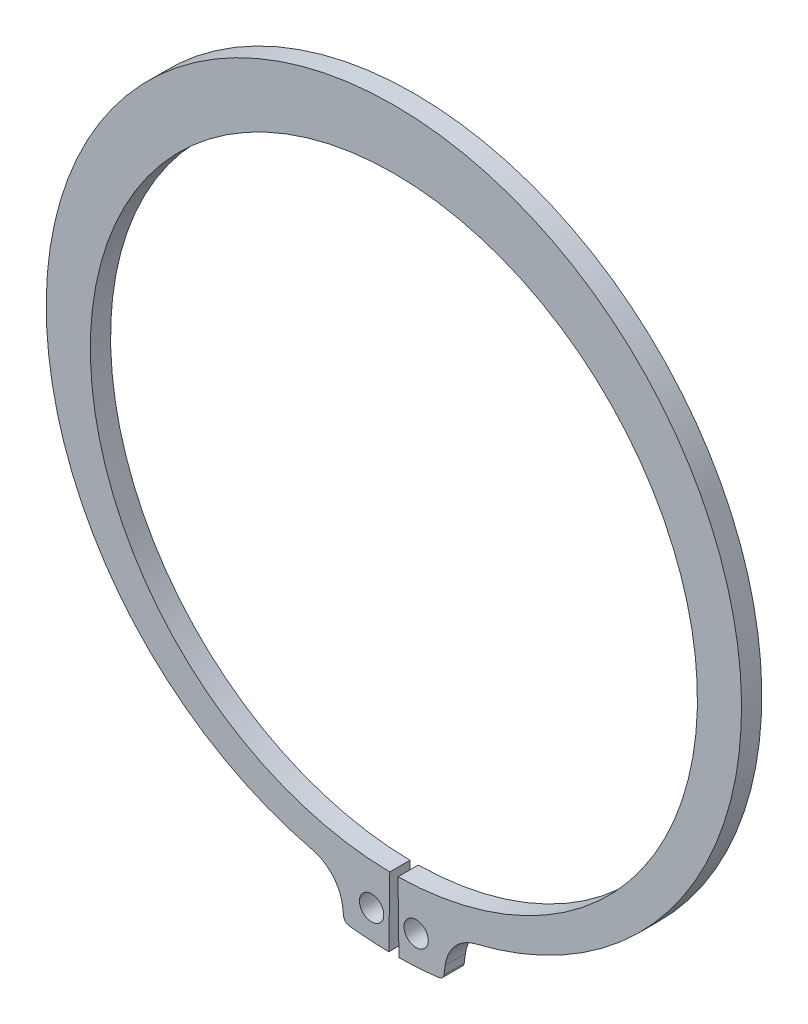
ISO-10303-21;
HEADER;
FILE_DESCRIPTION(('STEP AP214'),'2;1');
FILE_NAME('part.step','',(''),(''),'','','');
FILE_SCHEMA(('AUTOMOTIVE_DESIGN { 1 0 10303 214 1 1 1 1 }'));
ENDSEC;
DATA;
#1=APPLICATION_CONTEXT('core data for automotive mechanical design processes');
#2=APPLICATION_PROTOCOL_DEFINITION('international standard','automotive_design',2000,#1);
#3=PRODUCT_CONTEXT('',#1,'mechanical');
#4=PRODUCT('Part','Part','',(#3));
#5=PRODUCT_RELATED_PRODUCT_CATEGORY('part','',(#4));
#6=PRODUCT_DEFINITION_FORMATION('','',#4);
#7=PRODUCT_DEFINITION_CONTEXT('part definition',#1,'design');
#8=PRODUCT_DEFINITION('design','',#6,#7);
#9=PRODUCT_DEFINITION_SHAPE('','',#8);
#10=(LENGTH_UNIT() NAMED_UNIT(*) SI_UNIT(.MILLI.,.METRE.));
#11=(NAMED_UNIT(*) PLANE_ANGLE_UNIT() SI_UNIT($,.RADIAN.));
#12=(NAMED_UNIT(*) SI_UNIT($,.STERADIAN.) SOLID_ANGLE_UNIT());
#13=UNCERTAINTY_MEASURE_WITH_UNIT(LENGTH_MEASURE(1.E-05),#10,'distance_accuracy_value','');
#14=(GEOMETRIC_REPRESENTATION_CONTEXT(3) GLOBAL_UNCERTAINTY_ASSIGNED_CONTEXT((#13)) GLOBAL_UNIT_ASSIGNED_CONTEXT((#10,
#11,#12)) REPRESENTATION_CONTEXT('',''));
#15=CARTESIAN_POINT('',(0.,0.,0.));
#16=DIRECTION('',(0.,0.,1.));
#17=DIRECTION('',(1.,0.,0.));
#18=AXIS2_PLACEMENT_3D('',#15,#16,#17);
#19=CARTESIAN_POINT('',(0.,0.,-2.5));
#20=DIRECTION('',(0.,0.,1.));
#21=DIRECTION('',(1.,0.,0.));
#22=AXIS2_PLACEMENT_3D('',#19,#20,#21);
#23=CYLINDRICAL_SURFACE('',#22,37.5);
#24=CARTESIAN_POINT('',(0.,0.,0.));
#25=DIRECTION('',(0.,0.,-1.));
#26=DIRECTION('',(1.,0.,0.));
#27=AXIS2_PLACEMENT_3D('',#24,#25,#26);
#28=CIRCLE('',#27,37.5);
#29=CARTESIAN_POINT('',(-0.508405639913232,-37.4965534910251,0.));
#30=VERTEX_POINT('',#29);
#31=CARTESIAN_POINT('',(0.508405639913232,-37.4965534910251,0.));
#32=VERTEX_POINT('',#31);
#33=EDGE_CURVE('E155',#30,#32,#28,.T.);
#34=ORIENTED_EDGE('',*,*,#33,.F.);
#35=DIRECTION('',(0.,0.,1.));
#36=VECTOR('',#35,1.);
#37=CARTESIAN_POINT('',(-0.508405639913232,-37.4965534910251,-2.5));
#38=LINE('',#37,#36);
#39=CARTESIAN_POINT('',(-0.508405639913232,-37.4965534910251,-2.5));
#40=VERTEX_POINT('',#39);
#41=EDGE_CURVE('E11',#40,#30,#38,.T.);
#42=ORIENTED_EDGE('',*,*,#41,.F.);
#43=CARTESIAN_POINT('',(0.,0.,-2.5));
#44=DIRECTION('',(0.,0.,-1.));
#45=DIRECTION('',(1.,0.,0.));
#46=AXIS2_PLACEMENT_3D('',#43,#44,#45);
#47=CIRCLE('',#46,37.5);
#48=CARTESIAN_POINT('',(0.508405639913232,-37.4965534910251,-2.5));
#49=VERTEX_POINT('',#48);
#50=EDGE_CURVE('E188',#40,#49,#47,.T.);
#51=ORIENTED_EDGE('',*,*,#50,.T.);
#52=DIRECTION('',(0.,0.,1.));
#53=VECTOR('',#52,1.);
#54=CARTESIAN_POINT('',(0.508405639913232,-37.4965534910251,-2.5));
#55=LINE('',#54,#53);
#56=EDGE_CURVE('E37',#49,#32,#55,.T.);
#57=ORIENTED_EDGE('',*,*,#56,.T.);
#58=EDGE_LOOP('',(#34,#42,#51,#57));
#59=FACE_BOUND('',#58,.T.);
#60=ADVANCED_FACE('F34',(#59),#23,.F.);
#61=CARTESIAN_POINT('',(-0.508405639913232,-37.4965534910251,-2.5));
#62=DIRECTION('',(0.999908093094002,-0.0135574837310195,0.));
#63=DIRECTION('',(0.0135574837310195,0.999908093094002,0.));
#64=AXIS2_PLACEMENT_3D('',#61,#62,#63);
#65=PLANE('',#64);
#66=DIRECTION('',(0.0135574837310195,0.999908093094002,0.));
#67=VECTOR('',#66,1.);
#68=CARTESIAN_POINT('',(-0.508405639913232,-37.4965534910251,0.));
#69=LINE('',#68,#67);
#70=CARTESIAN_POINT('',(-0.625,-46.0957630916335,0.));
#71=VERTEX_POINT('',#70);
#72=EDGE_CURVE('E186',#71,#30,#69,.T.);
#73=ORIENTED_EDGE('',*,*,#72,.F.);
#74=DIRECTION('',(0.,0.,1.));
#75=VECTOR('',#74,1.);
#76=CARTESIAN_POINT('',(-0.625,-46.0957630916335,-2.5));
#77=LINE('',#76,#75);
#78=CARTESIAN_POINT('',(-0.625,-46.0957630916335,-2.5));
#79=VERTEX_POINT('',#78);
#80=EDGE_CURVE('E43',#79,#71,#77,.T.);
#81=ORIENTED_EDGE('',*,*,#80,.F.);
#82=DIRECTION('',(0.0135574837310195,0.999908093094002,0.));
#83=VECTOR('',#82,1.);
#84=CARTESIAN_POINT('',(-0.508405639913232,-37.4965534910251,-2.5));
#85=LINE('',#84,#83);
#86=EDGE_CURVE('E145',#79,#40,#85,.T.);
#87=ORIENTED_EDGE('',*,*,#86,.T.);
#88=ORIENTED_EDGE('',*,*,#41,.T.);
#89=EDGE_LOOP('',(#73,#81,#87,#88));
#90=FACE_BOUND('',#89,.T.);
#91=ADVANCED_FACE('F208',(#90),#65,.T.);
#92=CARTESIAN_POINT('',(0.,0.,-2.5));
#93=DIRECTION('',(0.,0.,1.));
#94=DIRECTION('',(1.,0.,0.));
#95=AXIS2_PLACEMENT_3D('',#92,#93,#94);
#96=CYLINDRICAL_SURFACE('',#95,46.1);
#97=CARTESIAN_POINT('',(0.,0.,0.));
#98=DIRECTION('',(0.,0.,1.));
#99=DIRECTION('',(1.,0.,0.));
#100=AXIS2_PLACEMENT_3D('',#97,#98,#99);
#101=CIRCLE('',#100,46.1);
#102=CARTESIAN_POINT('',(-5.5462924546099,-45.7651465638201,0.));
#103=VERTEX_POINT('',#102);
#104=EDGE_CURVE('E132',#103,#71,#101,.T.);
#105=ORIENTED_EDGE('',*,*,#104,.F.);
#106=DIRECTION('',(0.,0.,1.));
#107=VECTOR('',#106,1.);
#108=CARTESIAN_POINT('',(-5.5462924546099,-45.7651465638201,-2.5));
#109=LINE('',#108,#107);
#110=CARTESIAN_POINT('',(-5.5462924546099,-45.7651465638201,-2.5));
#111=VERTEX_POINT('',#110);
#112=EDGE_CURVE('E127',#111,#103,#109,.T.);
#113=ORIENTED_EDGE('',*,*,#112,.F.);
#114=CARTESIAN_POINT('',(0.,0.,-2.5));
#115=DIRECTION('',(0.,0.,1.));
#116=DIRECTION('',(1.,0.,0.));
#117=AXIS2_PLACEMENT_3D('',#114,#115,#116);
#118=CIRCLE('',#117,46.1);
#119=EDGE_CURVE('E130',#111,#79,#118,.T.);
#120=ORIENTED_EDGE('',*,*,#119,.T.);
#121=ORIENTED_EDGE('',*,*,#80,.T.);
#122=EDGE_LOOP('',(#105,#113,#120,#121));
#123=FACE_BOUND('',#122,.T.);
#124=ADVANCED_FACE('F129',(#123),#96,.T.);
#125=CARTESIAN_POINT('',(-5.45605993094489,-45.0205942878361,-2.5));
#126=DIRECTION('',(0.,0.,1.));
#127=DIRECTION('',(1.,0.,0.));
#128=AXIS2_PLACEMENT_3D('',#125,#126,#127);
#129=CYLINDRICAL_SURFACE('',#128,0.75);
#130=CARTESIAN_POINT('',(-5.45605993094489,-45.0205942878361,0.));
#131=DIRECTION('',(0.,0.,1.));
#132=DIRECTION('',(1.,0.,0.));
#133=AXIS2_PLACEMENT_3D('',#130,#131,#132);
#134=CIRCLE('',#133,0.75);
#135=CARTESIAN_POINT('',(-6.19964357697525,-45.1184889320011,0.));
#136=VERTEX_POINT('',#135);
#137=EDGE_CURVE('E183',#136,#103,#134,.T.);
#138=ORIENTED_EDGE('',*,*,#137,.F.);
#139=DIRECTION('',(0.,0.,1.));
#140=VECTOR('',#139,1.);
#141=CARTESIAN_POINT('',(-6.19964357697525,-45.1184889320011,-2.5));
#142=LINE('',#141,#140);
#143=CARTESIAN_POINT('',(-6.19964357697525,-45.1184889320011,-2.5));
#144=VERTEX_POINT('',#143);
#145=EDGE_CURVE('E137',#144,#136,#142,.T.);
#146=ORIENTED_EDGE('',*,*,#145,.F.);
#147=CARTESIAN_POINT('',(-5.45605993094489,-45.0205942878361,-2.5));
#148=DIRECTION('',(0.,0.,1.));
#149=DIRECTION('',(1.,0.,0.));
#150=AXIS2_PLACEMENT_3D('',#147,#148,#149);
#151=CIRCLE('',#150,0.75);
#152=EDGE_CURVE('E143',#144,#111,#151,.T.);
#153=ORIENTED_EDGE('',*,*,#152,.T.);
#154=ORIENTED_EDGE('',*,*,#112,.T.);
#155=EDGE_LOOP('',(#138,#146,#153,#154));
#156=FACE_BOUND('',#155,.T.);
#157=ADVANCED_FACE('F147',(#156),#129,.T.);
#158=CARTESIAN_POINT('',(-6.33885093513878,-44.0611040687088,-2.5));
#159=DIRECTION('',(-0.99144486137381,-0.130526192220052,0.));
#160=DIRECTION('',(0.130526192220052,-0.99144486137381,0.));
#161=AXIS2_PLACEMENT_3D('',#158,#159,#160);
#162=PLANE('',#161);
#163=DIRECTION('',(0.130526192220052,-0.99144486137381,0.));
#164=VECTOR('',#163,1.);
#165=CARTESIAN_POINT('',(-6.33885093513878,-44.0611040687088,0.));
#166=LINE('',#165,#164);
#167=CARTESIAN_POINT('',(-6.33885093513878,-44.0611040687088,0.));
#168=VERTEX_POINT('',#167);
#169=EDGE_CURVE('E180',#168,#136,#166,.T.);
#170=ORIENTED_EDGE('',*,*,#169,.F.);
#171=DIRECTION('',(0.,0.,1.));
#172=VECTOR('',#171,1.);
#173=CARTESIAN_POINT('',(-6.33885093513878,-44.0611040687088,-2.5));
#174=LINE('',#173,#172);
#175=CARTESIAN_POINT('',(-6.33885093513878,-44.0611040687088,-2.5));
#176=VERTEX_POINT('',#175);
#177=EDGE_CURVE('E192',#176,#168,#174,.T.);
#178=ORIENTED_EDGE('',*,*,#177,.F.);
#179=DIRECTION('',(0.130526192220052,-0.99144486137381,0.));
#180=VECTOR('',#179,1.);
#181=CARTESIAN_POINT('',(-6.33885093513878,-44.0611040687088,-2.5));
#182=LINE('',#181,#180);
#183=EDGE_CURVE('E148',#176,#144,#182,.T.);
#184=ORIENTED_EDGE('',*,*,#183,.T.);
#185=ORIENTED_EDGE('',*,*,#145,.T.);
#186=EDGE_LOOP('',(#170,#178,#184,#185));
#187=FACE_BOUND('',#186,.T.);
#188=ADVANCED_FACE('F221',(#187),#162,.T.);
#189=CARTESIAN_POINT('',(-11.2462595608808,-44.7071766709697,-2.5));
#190=DIRECTION('',(0.,0.,1.));
#191=DIRECTION('',(1.,0.,0.));
#192=AXIS2_PLACEMENT_3D('',#189,#190,#191);
#193=CYLINDRICAL_SURFACE('',#192,4.94975446132422);
#194=CARTESIAN_POINT('',(-11.2462595608808,-44.7071766709697,0.));
#195=DIRECTION('',(0.,0.,-1.));
#196=DIRECTION('',(1.,0.,0.));
#197=AXIS2_PLACEMENT_3D('',#194,#195,#196);
#198=CIRCLE('',#197,4.94975446132422);
#199=CARTESIAN_POINT('',(-10.084076166299,-39.8957944387253,0.));
#200=VERTEX_POINT('',#199);
#201=EDGE_CURVE('E177',#200,#168,#198,.T.);
#202=ORIENTED_EDGE('',*,*,#201,.F.);
#203=DIRECTION('',(0.,0.,1.));
#204=VECTOR('',#203,1.);
#205=CARTESIAN_POINT('',(-10.084076166299,-39.8957944387253,-2.5));
#206=LINE('',#205,#204);
#207=CARTESIAN_POINT('',(-10.084076166299,-39.8957944387253,-2.5));
#208=VERTEX_POINT('',#207);
#209=EDGE_CURVE('E194',#208,#200,#206,.T.);
#210=ORIENTED_EDGE('',*,*,#209,.F.);
#211=CARTESIAN_POINT('',(-11.2462595608808,-44.7071766709697,-2.5));
#212=DIRECTION('',(0.,0.,-1.));
#213=DIRECTION('',(1.,0.,0.));
#214=AXIS2_PLACEMENT_3D('',#211,#212,#213);
#215=CIRCLE('',#214,4.94975446132422);
#216=EDGE_CURVE('E150',#208,#176,#215,.T.);
#217=ORIENTED_EDGE('',*,*,#216,.T.);
#218=ORIENTED_EDGE('',*,*,#177,.T.);
#219=EDGE_LOOP('',(#202,#210,#217,#218));
#220=FACE_BOUND('',#219,.T.);
#221=ADVANCED_FACE('F224',(#220),#193,.F.);
#222=CARTESIAN_POINT('',(0.,1.85178612500171,-2.5));
#223=DIRECTION('',(0.,0.,1.));
#224=DIRECTION('',(1.,0.,0.));
#225=AXIS2_PLACEMENT_3D('',#222,#223,#224);
#226=CYLINDRICAL_SURFACE('',#225,42.9482138749983);
#227=CARTESIAN_POINT('',(0.,1.85178612500171,0.));
#228=DIRECTION('',(0.,0.,1.));
#229=DIRECTION('',(1.,0.,0.));
#230=AXIS2_PLACEMENT_3D('',#227,#228,#229);
#231=CIRCLE('',#230,42.9482138749983);
#232=CARTESIAN_POINT('',(10.0840761662989,-39.8957944387253,0.));
#233=VERTEX_POINT('',#232);
#234=EDGE_CURVE('E174',#233,#200,#231,.T.);
#235=ORIENTED_EDGE('',*,*,#234,.F.);
#236=DIRECTION('',(0.,0.,1.));
#237=VECTOR('',#236,1.);
#238=CARTESIAN_POINT('',(10.0840761662989,-39.8957944387253,-2.5));
#239=LINE('',#238,#237);
#240=CARTESIAN_POINT('',(10.0840761662989,-39.8957944387253,-2.5));
#241=VERTEX_POINT('',#240);
#242=EDGE_CURVE('E196',#241,#233,#239,.T.);
#243=ORIENTED_EDGE('',*,*,#242,.F.);
#244=CARTESIAN_POINT('',(0.,1.85178612500171,-2.5));
#245=DIRECTION('',(0.,0.,1.));
#246=DIRECTION('',(1.,0.,0.));
#247=AXIS2_PLACEMENT_3D('',#244,#245,#246);
#248=CIRCLE('',#247,42.9482138749983);
#249=EDGE_CURVE('E298',#241,#208,#248,.T.);
#250=ORIENTED_EDGE('',*,*,#249,.T.);
#251=ORIENTED_EDGE('',*,*,#209,.T.);
#252=EDGE_LOOP('',(#235,#243,#250,#251));
#253=FACE_BOUND('',#252,.T.);
#254=ADVANCED_FACE('F228',(#253),#226,.T.);
#255=CARTESIAN_POINT('',(11.2462595608808,-44.7071766709697,-2.5));
#256=DIRECTION('',(0.,0.,1.));
#257=DIRECTION('',(1.,0.,0.));
#258=AXIS2_PLACEMENT_3D('',#255,#256,#257);
#259=CYLINDRICAL_SURFACE('',#258,4.94975446132422);
#260=CARTESIAN_POINT('',(11.2462595608808,-44.7071766709697,0.));
#261=DIRECTION('',(0.,0.,-1.));
#262=DIRECTION('',(1.,0.,0.));
#263=AXIS2_PLACEMENT_3D('',#260,#261,#262);
#264=CIRCLE('',#263,4.94975446132422);
#265=CARTESIAN_POINT('',(6.33885093513878,-44.0611040687089,0.));
#266=VERTEX_POINT('',#265);
#267=EDGE_CURVE('E171',#266,#233,#264,.T.);
#268=ORIENTED_EDGE('',*,*,#267,.F.);
#269=DIRECTION('',(0.,0.,1.));
#270=VECTOR('',#269,1.);
#271=CARTESIAN_POINT('',(6.33885093513878,-44.0611040687089,-2.5));
#272=LINE('',#271,#270);
#273=CARTESIAN_POINT('',(6.33885093513878,-44.0611040687089,-2.5));
#274=VERTEX_POINT('',#273);
#275=EDGE_CURVE('E198',#274,#266,#272,.T.);
#276=ORIENTED_EDGE('',*,*,#275,.F.);
#277=CARTESIAN_POINT('',(11.2462595608808,-44.7071766709697,-2.5));
#278=DIRECTION('',(0.,0.,-1.));
#279=DIRECTION('',(1.,0.,0.));
#280=AXIS2_PLACEMENT_3D('',#277,#278,#279);
#281=CIRCLE('',#280,4.94975446132422);
#282=EDGE_CURVE('E295',#274,#241,#281,.T.);
#283=ORIENTED_EDGE('',*,*,#282,.T.);
#284=ORIENTED_EDGE('',*,*,#242,.T.);
#285=EDGE_LOOP('',(#268,#276,#283,#284));
#286=FACE_BOUND('',#285,.T.);
#287=ADVANCED_FACE('F232',(#286),#259,.F.);
#288=CARTESIAN_POINT('',(6.33885093513879,-44.0611040687089,-2.5));
#289=DIRECTION('',(0.99144486137381,-0.130526192220055,0.));
#290=DIRECTION('',(0.130526192220055,0.99144486137381,0.));
#291=AXIS2_PLACEMENT_3D('',#288,#289,#290);
#292=PLANE('',#291);
#293=DIRECTION('',(0.130526192220055,0.99144486137381,0.));
#294=VECTOR('',#293,1.);
#295=CARTESIAN_POINT('',(6.33885093513879,-44.0611040687089,0.));
#296=LINE('',#295,#294);
#297=CARTESIAN_POINT('',(6.19964357697525,-45.1184889320011,0.));
#298=VERTEX_POINT('',#297);
#299=EDGE_CURVE('E168',#298,#266,#296,.T.);
#300=ORIENTED_EDGE('',*,*,#299,.F.);
#301=DIRECTION('',(0.,0.,1.));
#302=VECTOR('',#301,1.);
#303=CARTESIAN_POINT('',(6.19964357697525,-45.1184889320011,-2.5));
#304=LINE('',#303,#302);
#305=CARTESIAN_POINT('',(6.19964357697525,-45.1184889320011,-2.5));
#306=VERTEX_POINT('',#305);
#307=EDGE_CURVE('E200',#306,#298,#304,.T.);
#308=ORIENTED_EDGE('',*,*,#307,.F.);
#309=DIRECTION('',(0.130526192220055,0.99144486137381,0.));
#310=VECTOR('',#309,1.);
#311=CARTESIAN_POINT('',(6.33885093513879,-44.0611040687089,-2.5));
#312=LINE('',#311,#310);
#313=EDGE_CURVE('E292',#306,#274,#312,.T.);
#314=ORIENTED_EDGE('',*,*,#313,.T.);
#315=ORIENTED_EDGE('',*,*,#275,.T.);
#316=EDGE_LOOP('',(#300,#308,#314,#315));
#317=FACE_BOUND('',#316,.T.);
#318=ADVANCED_FACE('F236',(#317),#292,.T.);
#319=CARTESIAN_POINT('',(5.45605993094489,-45.0205942878361,-2.5));
#320=DIRECTION('',(0.,0.,1.));
#321=DIRECTION('',(1.,0.,0.));
#322=AXIS2_PLACEMENT_3D('',#319,#320,#321);
#323=CYLINDRICAL_SURFACE('',#322,0.75);
#324=CARTESIAN_POINT('',(5.45605993094489,-45.0205942878361,0.));
#325=DIRECTION('',(0.,0.,1.));
#326=DIRECTION('',(-1.,0.,0.));
#327=AXIS2_PLACEMENT_3D('',#324,#325,#326);
#328=CIRCLE('',#327,0.75);
#329=CARTESIAN_POINT('',(5.54629245460991,-45.7651465638201,0.));
#330=VERTEX_POINT('',#329);
#331=EDGE_CURVE('E165',#330,#298,#328,.T.);
#332=ORIENTED_EDGE('',*,*,#331,.F.);
#333=DIRECTION('',(0.,0.,1.));
#334=VECTOR('',#333,1.);
#335=CARTESIAN_POINT('',(5.54629245460991,-45.7651465638201,-2.5));
#336=LINE('',#335,#334);
#337=CARTESIAN_POINT('',(5.54629245460991,-45.7651465638201,-2.5));
#338=VERTEX_POINT('',#337);
#339=EDGE_CURVE('E202',#338,#330,#336,.T.);
#340=ORIENTED_EDGE('',*,*,#339,.F.);
#341=CARTESIAN_POINT('',(5.45605993094489,-45.0205942878361,-2.5));
#342=DIRECTION('',(0.,0.,1.));
#343=DIRECTION('',(-1.,0.,0.));
#344=AXIS2_PLACEMENT_3D('',#341,#342,#343);
#345=CIRCLE('',#344,0.75);
#346=EDGE_CURVE('E289',#338,#306,#345,.T.);
#347=ORIENTED_EDGE('',*,*,#346,.T.);
#348=ORIENTED_EDGE('',*,*,#307,.T.);
#349=EDGE_LOOP('',(#332,#340,#347,#348));
#350=FACE_BOUND('',#349,.T.);
#351=ADVANCED_FACE('F240',(#350),#323,.T.);
#352=CARTESIAN_POINT('',(0.,0.,-2.5));
#353=DIRECTION('',(0.,0.,1.));
#354=DIRECTION('',(1.,0.,0.));
#355=AXIS2_PLACEMENT_3D('',#352,#353,#354);
#356=CYLINDRICAL_SURFACE('',#355,46.1);
#357=CARTESIAN_POINT('',(0.,0.,0.));
#358=DIRECTION('',(0.,0.,1.));
#359=DIRECTION('',(1.,0.,0.));
#360=AXIS2_PLACEMENT_3D('',#357,#358,#359);
#361=CIRCLE('',#360,46.1);
#362=CARTESIAN_POINT('',(0.624999999999982,-46.0957630916335,0.));
#363=VERTEX_POINT('',#362);
#364=EDGE_CURVE('E162',#363,#330,#361,.T.);
#365=ORIENTED_EDGE('',*,*,#364,.F.);
#366=DIRECTION('',(0.,0.,1.));
#367=VECTOR('',#366,1.);
#368=CARTESIAN_POINT('',(0.624999999999982,-46.0957630916335,-2.5));
#369=LINE('',#368,#367);
#370=CARTESIAN_POINT('',(0.624999999999982,-46.0957630916335,-2.5));
#371=VERTEX_POINT('',#370);
#372=EDGE_CURVE('E203',#371,#363,#369,.T.);
#373=ORIENTED_EDGE('',*,*,#372,.F.);
#374=CARTESIAN_POINT('',(0.,0.,-2.5));
#375=DIRECTION('',(0.,0.,1.));
#376=DIRECTION('',(1.,0.,0.));
#377=AXIS2_PLACEMENT_3D('',#374,#375,#376);
#378=CIRCLE('',#377,46.1);
#379=EDGE_CURVE('E286',#371,#338,#378,.T.);
#380=ORIENTED_EDGE('',*,*,#379,.T.);
#381=ORIENTED_EDGE('',*,*,#339,.T.);
#382=EDGE_LOOP('',(#365,#373,#380,#381));
#383=FACE_BOUND('',#382,.T.);
#384=ADVANCED_FACE('F244',(#383),#356,.T.);
#385=CARTESIAN_POINT('',(0.508405639913232,-37.4965534910251,-2.5));
#386=DIRECTION('',(-0.999908093094002,-0.0135574837310195,0.));
#387=DIRECTION('',(0.0135574837310195,-0.999908093094002,0.));
#388=AXIS2_PLACEMENT_3D('',#385,#386,#387);
#389=PLANE('',#388);
#390=DIRECTION('',(0.0135574837310195,-0.999908093094002,0.));
#391=VECTOR('',#390,1.);
#392=CARTESIAN_POINT('',(0.508405639913232,-37.4965534910251,0.));
#393=LINE('',#392,#391);
#394=EDGE_CURVE('E158',#32,#363,#393,.T.);
#395=ORIENTED_EDGE('',*,*,#394,.F.);
#396=ORIENTED_EDGE('',*,*,#56,.F.);
#397=DIRECTION('',(0.0135574837310195,-0.999908093094002,0.));
#398=VECTOR('',#397,1.);
#399=CARTESIAN_POINT('',(0.508405639913232,-37.4965534910251,-2.5));
#400=LINE('',#399,#398);
#401=EDGE_CURVE('E284',#49,#371,#400,.T.);
#402=ORIENTED_EDGE('',*,*,#401,.T.);
#403=ORIENTED_EDGE('',*,*,#372,.T.);
#404=EDGE_LOOP('',(#395,#396,#402,#403));
#405=FACE_BOUND('',#404,.T.);
#406=ADVANCED_FACE('F205',(#405),#389,.T.);
#407=CARTESIAN_POINT('',(0.,0.,-2.5));
#408=DIRECTION('',(0.,0.,1.));
#409=DIRECTION('',(1.,0.,0.));
#410=AXIS2_PLACEMENT_3D('',#407,#408,#409);
#411=PLANE('',#410);
#412=CARTESIAN_POINT('',(-2.75,-42.4610409669853,-2.5));
#413=DIRECTION('',(0.,0.,1.));
#414=DIRECTION('',(1.,0.,0.));
#415=AXIS2_PLACEMENT_3D('',#412,#413,#414);
#416=CIRCLE('',#415,1.5);
#417=CARTESIAN_POINT('',(-1.25,-42.4610409669853,-2.5));
#418=VERTEX_POINT('',#417);
#419=EDGE_CURVE('E271',#418,#418,#416,.T.);
#420=ORIENTED_EDGE('',*,*,#419,.T.);
#421=EDGE_LOOP('',(#420));
#422=FACE_BOUND('',#421,.T.);
#423=CARTESIAN_POINT('',(2.75,-42.4610409669853,-2.5));
#424=DIRECTION('',(0.,0.,1.));
#425=DIRECTION('',(1.,0.,0.));
#426=AXIS2_PLACEMENT_3D('',#423,#424,#425);
#427=CIRCLE('',#426,1.5);
#428=CARTESIAN_POINT('',(4.25,-42.4610409669853,-2.5));
#429=VERTEX_POINT('',#428);
#430=EDGE_CURVE('E159',#429,#429,#427,.T.);
#431=ORIENTED_EDGE('',*,*,#430,.T.);
#432=EDGE_LOOP('',(#431));
#433=FACE_BOUND('',#432,.T.);
#434=ORIENTED_EDGE('',*,*,#50,.F.);
#435=ORIENTED_EDGE('',*,*,#86,.F.);
#436=ORIENTED_EDGE('',*,*,#119,.F.);
#437=ORIENTED_EDGE('',*,*,#152,.F.);
#438=ORIENTED_EDGE('',*,*,#183,.F.);
#439=ORIENTED_EDGE('',*,*,#216,.F.);
#440=ORIENTED_EDGE('',*,*,#249,.F.);
#441=ORIENTED_EDGE('',*,*,#282,.F.);
#442=ORIENTED_EDGE('',*,*,#313,.F.);
#443=ORIENTED_EDGE('',*,*,#346,.F.);
#444=ORIENTED_EDGE('',*,*,#379,.F.);
#445=ORIENTED_EDGE('',*,*,#401,.F.);
#446=EDGE_LOOP('',(#434,#435,#436,#437,#438,#439,#440,#441,#442,#443,#444,#445));
#447=FACE_BOUND('',#446,.T.);
#448=ADVANCED_FACE('F141',(#422,#433,#447),#411,.F.);
#449=CARTESIAN_POINT('',(0.,0.,0.));
#450=DIRECTION('',(0.,0.,1.));
#451=DIRECTION('',(1.,0.,0.));
#452=AXIS2_PLACEMENT_3D('',#449,#450,#451);
#453=PLANE('',#452);
#454=CARTESIAN_POINT('',(-2.75,-42.4610409669853,0.));
#455=DIRECTION('',(0.,0.,1.));
#456=DIRECTION('',(1.,0.,0.));
#457=AXIS2_PLACEMENT_3D('',#454,#455,#456);
#458=CIRCLE('',#457,1.5);
#459=CARTESIAN_POINT('',(-1.25,-42.4610409669853,0.));
#460=VERTEX_POINT('',#459);
#461=EDGE_CURVE('E274',#460,#460,#458,.T.);
#462=ORIENTED_EDGE('',*,*,#461,.F.);
#463=EDGE_LOOP('',(#462));
#464=FACE_BOUND('',#463,.T.);
#465=CARTESIAN_POINT('',(2.75,-42.4610409669853,0.));
#466=DIRECTION('',(0.,0.,1.));
#467=DIRECTION('',(1.,0.,0.));
#468=AXIS2_PLACEMENT_3D('',#465,#466,#467);
#469=CIRCLE('',#468,1.5);
#470=CARTESIAN_POINT('',(4.25,-42.4610409669853,0.));
#471=VERTEX_POINT('',#470);
#472=EDGE_CURVE('E276',#471,#471,#469,.T.);
#473=ORIENTED_EDGE('',*,*,#472,.F.);
#474=EDGE_LOOP('',(#473));
#475=FACE_BOUND('',#474,.T.);
#476=ORIENTED_EDGE('',*,*,#33,.T.);
#477=ORIENTED_EDGE('',*,*,#394,.T.);
#478=ORIENTED_EDGE('',*,*,#364,.T.);
#479=ORIENTED_EDGE('',*,*,#331,.T.);
#480=ORIENTED_EDGE('',*,*,#299,.T.);
#481=ORIENTED_EDGE('',*,*,#267,.T.);
#482=ORIENTED_EDGE('',*,*,#234,.T.);
#483=ORIENTED_EDGE('',*,*,#201,.T.);
#484=ORIENTED_EDGE('',*,*,#169,.T.);
#485=ORIENTED_EDGE('',*,*,#137,.T.);
#486=ORIENTED_EDGE('',*,*,#104,.T.);
#487=ORIENTED_EDGE('',*,*,#72,.T.);
#488=EDGE_LOOP('',(#476,#477,#478,#479,#480,#481,#482,#483,#484,#485,#486,#487));
#489=FACE_BOUND('',#488,.T.);
#490=ADVANCED_FACE('F207',(#464,#475,#489),#453,.T.);
#491=CARTESIAN_POINT('',(2.75,-42.4610409669853,-2.5));
#492=DIRECTION('',(0.,0.,1.));
#493=DIRECTION('',(1.,0.,0.));
#494=AXIS2_PLACEMENT_3D('',#491,#492,#493);
#495=CYLINDRICAL_SURFACE('',#494,1.5);
#496=ORIENTED_EDGE('',*,*,#430,.F.);
#497=EDGE_LOOP('',(#496));
#498=FACE_BOUND('',#497,.T.);
#499=ORIENTED_EDGE('',*,*,#472,.T.);
#500=EDGE_LOOP('',(#499));
#501=FACE_BOUND('',#500,.T.);
#502=ADVANCED_FACE('F256',(#498,#501),#495,.F.);
#503=CARTESIAN_POINT('',(-2.75,-42.4610409669853,-2.5));
#504=DIRECTION('',(0.,0.,1.));
#505=DIRECTION('',(1.,0.,0.));
#506=AXIS2_PLACEMENT_3D('',#503,#504,#505);
#507=CYLINDRICAL_SURFACE('',#506,1.5);
#508=ORIENTED_EDGE('',*,*,#419,.F.);
#509=EDGE_LOOP('',(#508));
#510=FACE_BOUND('',#509,.T.);
#511=ORIENTED_EDGE('',*,*,#461,.T.);
#512=EDGE_LOOP('',(#511));
#513=FACE_BOUND('',#512,.T.);
#514=ADVANCED_FACE('F263',(#510,#513),#507,.F.);
#515=CLOSED_SHELL('',(#60,#91,#124,#157,#188,#221,#254,#287,#318,#351,#384,#406,#448,#490,#502,#514));
#516=MANIFOLD_SOLID_BREP('B2',#515);
#517=ADVANCED_BREP_SHAPE_REPRESENTATION('',(#18,#516),#14);
#518=SHAPE_DEFINITION_REPRESENTATION(#9,#517);
ENDSEC;
END-ISO-10303-21;
